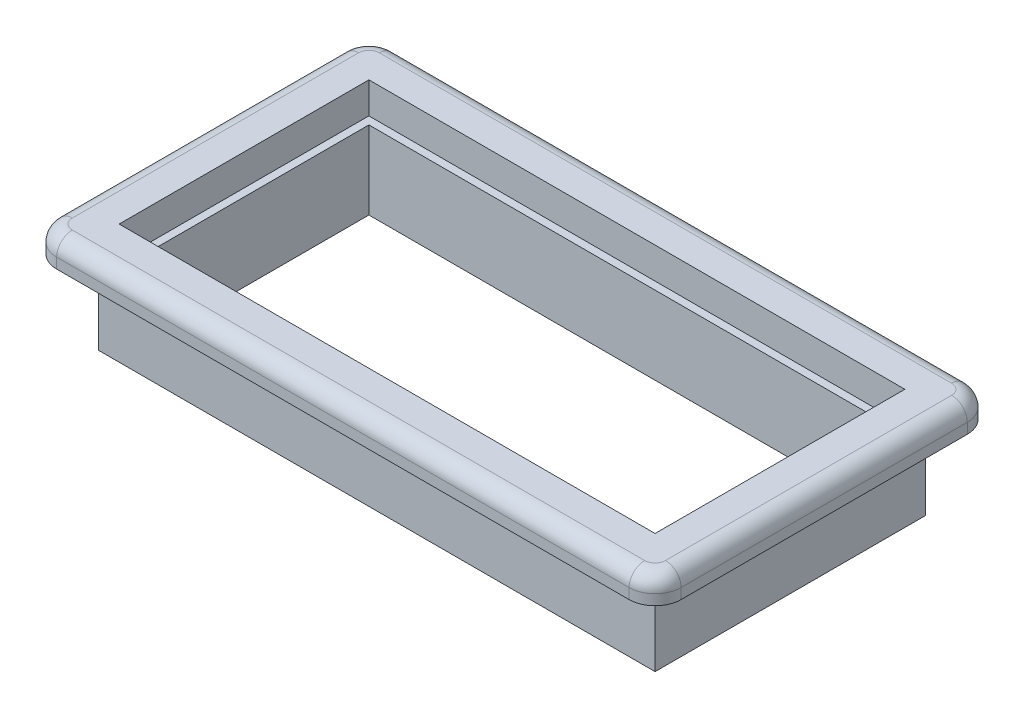
ISO-10303-21;
HEADER;
FILE_DESCRIPTION(('STEP AP214'),'2;1');
FILE_NAME('part.step','',(''),(''),'','','');
FILE_SCHEMA(('AUTOMOTIVE_DESIGN { 1 0 10303 214 1 1 1 1 }'));
ENDSEC;
DATA;
#1=APPLICATION_CONTEXT('core data for automotive mechanical design processes');
#2=APPLICATION_PROTOCOL_DEFINITION('international standard','automotive_design',2000,#1);
#3=PRODUCT_CONTEXT('',#1,'mechanical');
#4=PRODUCT('Part','Part','',(#3));
#5=PRODUCT_RELATED_PRODUCT_CATEGORY('part','',(#4));
#6=PRODUCT_DEFINITION_FORMATION('','',#4);
#7=PRODUCT_DEFINITION_CONTEXT('part definition',#1,'design');
#8=PRODUCT_DEFINITION('design','',#6,#7);
#9=PRODUCT_DEFINITION_SHAPE('','',#8);
#10=(LENGTH_UNIT() NAMED_UNIT(*) SI_UNIT(.MILLI.,.METRE.));
#11=(NAMED_UNIT(*) PLANE_ANGLE_UNIT() SI_UNIT($,.RADIAN.));
#12=(NAMED_UNIT(*) SI_UNIT($,.STERADIAN.) SOLID_ANGLE_UNIT());
#13=UNCERTAINTY_MEASURE_WITH_UNIT(LENGTH_MEASURE(1.E-05),#10,'distance_accuracy_value','');
#14=(GEOMETRIC_REPRESENTATION_CONTEXT(3) GLOBAL_UNCERTAINTY_ASSIGNED_CONTEXT((#13)) GLOBAL_UNIT_ASSIGNED_CONTEXT((#10,
#11,#12)) REPRESENTATION_CONTEXT('',''));
#15=CARTESIAN_POINT('',(0.,0.,0.));
#16=DIRECTION('',(0.,0.,1.));
#17=DIRECTION('',(1.,0.,0.));
#18=AXIS2_PLACEMENT_3D('',#15,#16,#17);
#19=CARTESIAN_POINT('',(-55.,5.,27.5));
#20=DIRECTION('',(0.,-1.,0.));
#21=DIRECTION('',(0.,0.,-1.));
#22=AXIS2_PLACEMENT_3D('',#19,#20,#21);
#23=PLANE('',#22);
#24=DIRECTION('',(1.,0.,0.));
#25=VECTOR('',#24,1.);
#26=CARTESIAN_POINT('',(51.5,5.,24.));
#27=LINE('',#26,#25);
#28=CARTESIAN_POINT('',(-51.5,5.,24.));
#29=VERTEX_POINT('',#28);
#30=CARTESIAN_POINT('',(51.5,5.,24.));
#31=VERTEX_POINT('',#30);
#32=EDGE_CURVE('E389',#29,#31,#27,.T.);
#33=ORIENTED_EDGE('',*,*,#32,.F.);
#34=DIRECTION('',(0.,0.,1.));
#35=VECTOR('',#34,1.);
#36=CARTESIAN_POINT('',(-51.5,5.,-24.));
#37=LINE('',#36,#35);
#38=CARTESIAN_POINT('',(-51.5,5.,-24.));
#39=VERTEX_POINT('',#38);
#40=EDGE_CURVE('E50',#39,#29,#37,.T.);
#41=ORIENTED_EDGE('',*,*,#40,.F.);
#42=DIRECTION('',(-1.,0.,0.));
#43=VECTOR('',#42,1.);
#44=CARTESIAN_POINT('',(51.5,5.,-24.));
#45=LINE('',#44,#43);
#46=CARTESIAN_POINT('',(51.5,5.,-24.));
#47=VERTEX_POINT('',#46);
#48=EDGE_CURVE('E379',#47,#39,#45,.T.);
#49=ORIENTED_EDGE('',*,*,#48,.F.);
#50=DIRECTION('',(0.,0.,-1.));
#51=VECTOR('',#50,1.);
#52=CARTESIAN_POINT('',(51.5,5.,-24.));
#53=LINE('',#52,#51);
#54=EDGE_CURVE('E392',#31,#47,#53,.T.);
#55=ORIENTED_EDGE('',*,*,#54,.F.);
#56=EDGE_LOOP('',(#33,#41,#49,#55));
#57=FACE_BOUND('',#56,.T.);
#58=DIRECTION('',(0.,0.,-1.));
#59=VECTOR('',#58,1.);
#60=CARTESIAN_POINT('',(57.,5.,27.5));
#61=LINE('',#60,#59);
#62=CARTESIAN_POINT('',(57.,5.,27.5));
#63=VERTEX_POINT('',#62);
#64=CARTESIAN_POINT('',(57.,5.,-27.5));
#65=VERTEX_POINT('',#64);
#66=EDGE_CURVE('E274',#63,#65,#61,.T.);
#67=ORIENTED_EDGE('',*,*,#66,.T.);
#68=CARTESIAN_POINT('',(55.,5.,-27.5));
#69=DIRECTION('',(0.,-1.,0.));
#70=DIRECTION('',(0.,0.,-1.));
#71=AXIS2_PLACEMENT_3D('',#68,#69,#70);
#72=CIRCLE('',#71,2.);
#73=CARTESIAN_POINT('',(55.,5.,-29.5));
#74=VERTEX_POINT('',#73);
#75=EDGE_CURVE('E276',#65,#74,#72,.F.);
#76=ORIENTED_EDGE('',*,*,#75,.T.);
#77=DIRECTION('',(-1.,0.,0.));
#78=VECTOR('',#77,1.);
#79=CARTESIAN_POINT('',(-55.,5.,-29.5));
#80=LINE('',#79,#78);
#81=CARTESIAN_POINT('',(-55.,5.,-29.5));
#82=VERTEX_POINT('',#81);
#83=EDGE_CURVE('E262',#74,#82,#80,.T.);
#84=ORIENTED_EDGE('',*,*,#83,.T.);
#85=CARTESIAN_POINT('',(-55.,5.,-27.5));
#86=DIRECTION('',(0.,-1.,0.));
#87=DIRECTION('',(0.,0.,-1.));
#88=AXIS2_PLACEMENT_3D('',#85,#86,#87);
#89=CIRCLE('',#88,2.);
#90=CARTESIAN_POINT('',(-57.,5.,-27.5));
#91=VERTEX_POINT('',#90);
#92=EDGE_CURVE('E264',#82,#91,#89,.F.);
#93=ORIENTED_EDGE('',*,*,#92,.T.);
#94=DIRECTION('',(0.,0.,1.));
#95=VECTOR('',#94,1.);
#96=CARTESIAN_POINT('',(-57.,5.,27.5));
#97=LINE('',#96,#95);
#98=CARTESIAN_POINT('',(-57.,5.,27.5));
#99=VERTEX_POINT('',#98);
#100=EDGE_CURVE('E266',#91,#99,#97,.T.);
#101=ORIENTED_EDGE('',*,*,#100,.T.);
#102=CARTESIAN_POINT('',(-55.,5.,27.5));
#103=DIRECTION('',(0.,-1.,0.));
#104=DIRECTION('',(0.,0.,-1.));
#105=AXIS2_PLACEMENT_3D('',#102,#103,#104);
#106=CIRCLE('',#105,2.);
#107=CARTESIAN_POINT('',(-55.,5.,29.5));
#108=VERTEX_POINT('',#107);
#109=EDGE_CURVE('E268',#99,#108,#106,.F.);
#110=ORIENTED_EDGE('',*,*,#109,.T.);
#111=DIRECTION('',(1.,0.,0.));
#112=VECTOR('',#111,1.);
#113=CARTESIAN_POINT('',(-55.,5.,29.5));
#114=LINE('',#113,#112);
#115=CARTESIAN_POINT('',(55.,5.,29.5));
#116=VERTEX_POINT('',#115);
#117=EDGE_CURVE('E270',#108,#116,#114,.T.);
#118=ORIENTED_EDGE('',*,*,#117,.T.);
#119=CARTESIAN_POINT('',(55.,5.,27.5));
#120=DIRECTION('',(0.,-1.,0.));
#121=DIRECTION('',(0.,0.,-1.));
#122=AXIS2_PLACEMENT_3D('',#119,#120,#121);
#123=CIRCLE('',#122,2.);
#124=EDGE_CURVE('E272',#116,#63,#123,.F.);
#125=ORIENTED_EDGE('',*,*,#124,.T.);
#126=EDGE_LOOP('',(#67,#76,#84,#93,#101,#110,#118,#125));
#127=FACE_BOUND('',#126,.T.);
#128=ADVANCED_FACE('F33',(#57,#127),#23,.F.);
#129=CARTESIAN_POINT('',(-55.,0.,27.5));
#130=DIRECTION('',(0.,-1.,0.));
#131=DIRECTION('',(0.,0.,-1.));
#132=AXIS2_PLACEMENT_3D('',#129,#130,#131);
#133=PLANE('',#132);
#134=DIRECTION('',(0.,0.,-1.));
#135=VECTOR('',#134,1.);
#136=CARTESIAN_POINT('',(-53.5,0.,-26.));
#137=LINE('',#136,#135);
#138=CARTESIAN_POINT('',(-53.5,0.,26.));
#139=VERTEX_POINT('',#138);
#140=CARTESIAN_POINT('',(-53.5,0.,-26.));
#141=VERTEX_POINT('',#140);
#142=EDGE_CURVE('E337',#139,#141,#137,.T.);
#143=ORIENTED_EDGE('',*,*,#142,.F.);
#144=DIRECTION('',(-1.,0.,0.));
#145=VECTOR('',#144,1.);
#146=CARTESIAN_POINT('',(-53.5,0.,26.));
#147=LINE('',#146,#145);
#148=CARTESIAN_POINT('',(53.5,0.,26.));
#149=VERTEX_POINT('',#148);
#150=EDGE_CURVE('E342',#149,#139,#147,.T.);
#151=ORIENTED_EDGE('',*,*,#150,.F.);
#152=DIRECTION('',(0.,0.,1.));
#153=VECTOR('',#152,1.);
#154=CARTESIAN_POINT('',(53.5,0.,26.));
#155=LINE('',#154,#153);
#156=CARTESIAN_POINT('',(53.5,0.,-26.));
#157=VERTEX_POINT('',#156);
#158=EDGE_CURVE('E354',#157,#149,#155,.T.);
#159=ORIENTED_EDGE('',*,*,#158,.F.);
#160=DIRECTION('',(1.,0.,0.));
#161=VECTOR('',#160,1.);
#162=CARTESIAN_POINT('',(53.5,0.,-26.));
#163=LINE('',#162,#161);
#164=EDGE_CURVE('E351',#141,#157,#163,.T.);
#165=ORIENTED_EDGE('',*,*,#164,.F.);
#166=EDGE_LOOP('',(#143,#151,#159,#165));
#167=FACE_BOUND('',#166,.T.);
#168=CARTESIAN_POINT('',(-55.,0.,27.5));
#169=DIRECTION('',(0.,1.,0.));
#170=DIRECTION('',(0.,0.,-1.));
#171=AXIS2_PLACEMENT_3D('',#168,#169,#170);
#172=CIRCLE('',#171,5.);
#173=CARTESIAN_POINT('',(-60.,0.,27.5));
#174=VERTEX_POINT('',#173);
#175=CARTESIAN_POINT('',(-55.,0.,32.5));
#176=VERTEX_POINT('',#175);
#177=EDGE_CURVE('E217',#174,#176,#172,.T.);
#178=ORIENTED_EDGE('',*,*,#177,.F.);
#179=DIRECTION('',(0.,0.,1.));
#180=VECTOR('',#179,1.);
#181=CARTESIAN_POINT('',(-60.,0.,27.5));
#182=LINE('',#181,#180);
#183=CARTESIAN_POINT('',(-60.,0.,-27.5));
#184=VERTEX_POINT('',#183);
#185=EDGE_CURVE('E243',#184,#174,#182,.T.);
#186=ORIENTED_EDGE('',*,*,#185,.F.);
#187=CARTESIAN_POINT('',(-55.,0.,-27.5));
#188=DIRECTION('',(0.,1.,0.));
#189=DIRECTION('',(0.,0.,-1.));
#190=AXIS2_PLACEMENT_3D('',#187,#188,#189);
#191=CIRCLE('',#190,5.);
#192=CARTESIAN_POINT('',(-55.,0.,-32.5));
#193=VERTEX_POINT('',#192);
#194=EDGE_CURVE('E240',#193,#184,#191,.T.);
#195=ORIENTED_EDGE('',*,*,#194,.F.);
#196=DIRECTION('',(-1.,0.,0.));
#197=VECTOR('',#196,1.);
#198=CARTESIAN_POINT('',(-55.,0.,-32.5));
#199=LINE('',#198,#197);
#200=CARTESIAN_POINT('',(55.,0.,-32.5));
#201=VERTEX_POINT('',#200);
#202=EDGE_CURVE('E237',#201,#193,#199,.T.);
#203=ORIENTED_EDGE('',*,*,#202,.F.);
#204=CARTESIAN_POINT('',(55.,0.,-27.5));
#205=DIRECTION('',(0.,1.,0.));
#206=DIRECTION('',(0.,0.,-1.));
#207=AXIS2_PLACEMENT_3D('',#204,#205,#206);
#208=CIRCLE('',#207,5.);
#209=CARTESIAN_POINT('',(60.,0.,-27.5));
#210=VERTEX_POINT('',#209);
#211=EDGE_CURVE('E234',#210,#201,#208,.T.);
#212=ORIENTED_EDGE('',*,*,#211,.F.);
#213=DIRECTION('',(0.,0.,-1.));
#214=VECTOR('',#213,1.);
#215=CARTESIAN_POINT('',(60.,0.,27.5));
#216=LINE('',#215,#214);
#217=CARTESIAN_POINT('',(60.,0.,27.5));
#218=VERTEX_POINT('',#217);
#219=EDGE_CURVE('E231',#218,#210,#216,.T.);
#220=ORIENTED_EDGE('',*,*,#219,.F.);
#221=CARTESIAN_POINT('',(55.,0.,27.5));
#222=DIRECTION('',(0.,1.,0.));
#223=DIRECTION('',(0.,0.,1.));
#224=AXIS2_PLACEMENT_3D('',#221,#222,#223);
#225=CIRCLE('',#224,5.);
#226=CARTESIAN_POINT('',(55.,0.,32.5));
#227=VERTEX_POINT('',#226);
#228=EDGE_CURVE('E228',#227,#218,#225,.T.);
#229=ORIENTED_EDGE('',*,*,#228,.F.);
#230=DIRECTION('',(1.,0.,0.));
#231=VECTOR('',#230,1.);
#232=CARTESIAN_POINT('',(-55.,0.,32.5));
#233=LINE('',#232,#231);
#234=EDGE_CURVE('E225',#176,#227,#233,.T.);
#235=ORIENTED_EDGE('',*,*,#234,.F.);
#236=EDGE_LOOP('',(#178,#186,#195,#203,#212,#220,#229,#235));
#237=FACE_BOUND('',#236,.T.);
#238=ADVANCED_FACE('F430',(#167,#237),#133,.T.);
#239=CARTESIAN_POINT('',(-55.,5.,27.5));
#240=DIRECTION('',(0.,-1.,0.));
#241=DIRECTION('',(0.,0.,-1.));
#242=AXIS2_PLACEMENT_3D('',#239,#240,#241);
#243=CYLINDRICAL_SURFACE('',#242,5.);
#244=DIRECTION('',(0.,-1.,0.));
#245=VECTOR('',#244,1.);
#246=CARTESIAN_POINT('',(-55.,5.,32.5));
#247=LINE('',#246,#245);
#248=CARTESIAN_POINT('',(-55.,2.,32.5));
#249=VERTEX_POINT('',#248);
#250=EDGE_CURVE('E260',#249,#176,#247,.T.);
#251=ORIENTED_EDGE('',*,*,#250,.F.);
#252=CARTESIAN_POINT('',(-55.,2.,27.5));
#253=DIRECTION('',(0.,-1.,0.));
#254=DIRECTION('',(0.,0.,-1.));
#255=AXIS2_PLACEMENT_3D('',#252,#253,#254);
#256=CIRCLE('',#255,5.);
#257=CARTESIAN_POINT('',(-60.,2.,27.5));
#258=VERTEX_POINT('',#257);
#259=EDGE_CURVE('E288',#249,#258,#256,.T.);
#260=ORIENTED_EDGE('',*,*,#259,.T.);
#261=DIRECTION('',(0.,-1.,0.));
#262=VECTOR('',#261,1.);
#263=CARTESIAN_POINT('',(-60.,5.,27.5));
#264=LINE('',#263,#262);
#265=EDGE_CURVE('E246',#258,#174,#264,.T.);
#266=ORIENTED_EDGE('',*,*,#265,.T.);
#267=ORIENTED_EDGE('',*,*,#177,.T.);
#268=EDGE_LOOP('',(#251,#260,#266,#267));
#269=FACE_BOUND('',#268,.T.);
#270=ADVANCED_FACE('F435',(#269),#243,.T.);
#271=CARTESIAN_POINT('',(-55.,5.,32.5));
#272=DIRECTION('',(0.,0.,-1.));
#273=DIRECTION('',(-1.,0.,0.));
#274=AXIS2_PLACEMENT_3D('',#271,#272,#273);
#275=PLANE('',#274);
#276=DIRECTION('',(0.,-1.,0.));
#277=VECTOR('',#276,1.);
#278=CARTESIAN_POINT('',(55.,5.,32.5));
#279=LINE('',#278,#277);
#280=CARTESIAN_POINT('',(55.,2.,32.5));
#281=VERTEX_POINT('',#280);
#282=EDGE_CURVE('E258',#281,#227,#279,.T.);
#283=ORIENTED_EDGE('',*,*,#282,.F.);
#284=DIRECTION('',(1.,0.,0.));
#285=VECTOR('',#284,1.);
#286=CARTESIAN_POINT('',(-55.,2.,32.5));
#287=LINE('',#286,#285);
#288=EDGE_CURVE('E286',#281,#249,#287,.F.);
#289=ORIENTED_EDGE('',*,*,#288,.T.);
#290=ORIENTED_EDGE('',*,*,#250,.T.);
#291=ORIENTED_EDGE('',*,*,#234,.T.);
#292=EDGE_LOOP('',(#283,#289,#290,#291));
#293=FACE_BOUND('',#292,.T.);
#294=ADVANCED_FACE('F464',(#293),#275,.F.);
#295=CARTESIAN_POINT('',(55.,5.,27.5));
#296=DIRECTION('',(0.,-1.,0.));
#297=DIRECTION('',(0.,0.,-1.));
#298=AXIS2_PLACEMENT_3D('',#295,#296,#297);
#299=CYLINDRICAL_SURFACE('',#298,5.);
#300=DIRECTION('',(0.,-1.,0.));
#301=VECTOR('',#300,1.);
#302=CARTESIAN_POINT('',(60.,5.,27.5));
#303=LINE('',#302,#301);
#304=CARTESIAN_POINT('',(60.,2.,27.5));
#305=VERTEX_POINT('',#304);
#306=EDGE_CURVE('E256',#305,#218,#303,.T.);
#307=ORIENTED_EDGE('',*,*,#306,.F.);
#308=CARTESIAN_POINT('',(55.,2.,27.5));
#309=DIRECTION('',(0.,-1.,0.));
#310=DIRECTION('',(0.,0.,-1.));
#311=AXIS2_PLACEMENT_3D('',#308,#309,#310);
#312=CIRCLE('',#311,5.);
#313=EDGE_CURVE('E284',#305,#281,#312,.T.);
#314=ORIENTED_EDGE('',*,*,#313,.T.);
#315=ORIENTED_EDGE('',*,*,#282,.T.);
#316=ORIENTED_EDGE('',*,*,#228,.T.);
#317=EDGE_LOOP('',(#307,#314,#315,#316));
#318=FACE_BOUND('',#317,.T.);
#319=ADVANCED_FACE('F460',(#318),#299,.T.);
#320=CARTESIAN_POINT('',(60.,5.,27.5));
#321=DIRECTION('',(-1.,0.,0.));
#322=DIRECTION('',(0.,0.,1.));
#323=AXIS2_PLACEMENT_3D('',#320,#321,#322);
#324=PLANE('',#323);
#325=DIRECTION('',(0.,-1.,0.));
#326=VECTOR('',#325,1.);
#327=CARTESIAN_POINT('',(60.,5.,-27.5));
#328=LINE('',#327,#326);
#329=CARTESIAN_POINT('',(60.,2.,-27.5));
#330=VERTEX_POINT('',#329);
#331=EDGE_CURVE('E254',#330,#210,#328,.T.);
#332=ORIENTED_EDGE('',*,*,#331,.F.);
#333=DIRECTION('',(0.,0.,-1.));
#334=VECTOR('',#333,1.);
#335=CARTESIAN_POINT('',(60.,2.,27.5));
#336=LINE('',#335,#334);
#337=EDGE_CURVE('E282',#330,#305,#336,.F.);
#338=ORIENTED_EDGE('',*,*,#337,.T.);
#339=ORIENTED_EDGE('',*,*,#306,.T.);
#340=ORIENTED_EDGE('',*,*,#219,.T.);
#341=EDGE_LOOP('',(#332,#338,#339,#340));
#342=FACE_BOUND('',#341,.T.);
#343=ADVANCED_FACE('F456',(#342),#324,.F.);
#344=CARTESIAN_POINT('',(55.,5.,-27.5));
#345=DIRECTION('',(0.,-1.,0.));
#346=DIRECTION('',(0.,0.,-1.));
#347=AXIS2_PLACEMENT_3D('',#344,#345,#346);
#348=CYLINDRICAL_SURFACE('',#347,5.);
#349=DIRECTION('',(0.,-1.,0.));
#350=VECTOR('',#349,1.);
#351=CARTESIAN_POINT('',(55.,5.,-32.5));
#352=LINE('',#351,#350);
#353=CARTESIAN_POINT('',(55.,2.,-32.5));
#354=VERTEX_POINT('',#353);
#355=EDGE_CURVE('E252',#354,#201,#352,.T.);
#356=ORIENTED_EDGE('',*,*,#355,.F.);
#357=CARTESIAN_POINT('',(55.,2.,-27.5));
#358=DIRECTION('',(0.,-1.,0.));
#359=DIRECTION('',(0.,0.,-1.));
#360=AXIS2_PLACEMENT_3D('',#357,#358,#359);
#361=CIRCLE('',#360,5.);
#362=EDGE_CURVE('E279',#354,#330,#361,.T.);
#363=ORIENTED_EDGE('',*,*,#362,.T.);
#364=ORIENTED_EDGE('',*,*,#331,.T.);
#365=ORIENTED_EDGE('',*,*,#211,.T.);
#366=EDGE_LOOP('',(#356,#363,#364,#365));
#367=FACE_BOUND('',#366,.T.);
#368=ADVANCED_FACE('F452',(#367),#348,.T.);
#369=CARTESIAN_POINT('',(-55.,5.,-32.5));
#370=DIRECTION('',(0.,0.,1.));
#371=DIRECTION('',(1.,0.,0.));
#372=AXIS2_PLACEMENT_3D('',#369,#370,#371);
#373=PLANE('',#372);
#374=DIRECTION('',(0.,-1.,0.));
#375=VECTOR('',#374,1.);
#376=CARTESIAN_POINT('',(-55.,5.,-32.5));
#377=LINE('',#376,#375);
#378=CARTESIAN_POINT('',(-55.,2.,-32.5));
#379=VERTEX_POINT('',#378);
#380=EDGE_CURVE('E250',#379,#193,#377,.T.);
#381=ORIENTED_EDGE('',*,*,#380,.F.);
#382=DIRECTION('',(-1.,0.,0.));
#383=VECTOR('',#382,1.);
#384=CARTESIAN_POINT('',(-55.,2.,-32.5));
#385=LINE('',#384,#383);
#386=EDGE_CURVE('E11',#379,#354,#385,.F.);
#387=ORIENTED_EDGE('',*,*,#386,.T.);
#388=ORIENTED_EDGE('',*,*,#355,.T.);
#389=ORIENTED_EDGE('',*,*,#202,.T.);
#390=EDGE_LOOP('',(#381,#387,#388,#389));
#391=FACE_BOUND('',#390,.T.);
#392=ADVANCED_FACE('F448',(#391),#373,.F.);
#393=CARTESIAN_POINT('',(-55.,5.,-27.5));
#394=DIRECTION('',(0.,-1.,0.));
#395=DIRECTION('',(0.,0.,-1.));
#396=AXIS2_PLACEMENT_3D('',#393,#394,#395);
#397=CYLINDRICAL_SURFACE('',#396,5.);
#398=DIRECTION('',(0.,-1.,0.));
#399=VECTOR('',#398,1.);
#400=CARTESIAN_POINT('',(-60.,5.,-27.5));
#401=LINE('',#400,#399);
#402=CARTESIAN_POINT('',(-60.,2.,-27.5));
#403=VERTEX_POINT('',#402);
#404=EDGE_CURVE('E248',#403,#184,#401,.T.);
#405=ORIENTED_EDGE('',*,*,#404,.F.);
#406=CARTESIAN_POINT('',(-55.,2.,-27.5));
#407=DIRECTION('',(0.,-1.,0.));
#408=DIRECTION('',(0.,0.,-1.));
#409=AXIS2_PLACEMENT_3D('',#406,#407,#408);
#410=CIRCLE('',#409,5.);
#411=EDGE_CURVE('E42',#403,#379,#410,.T.);
#412=ORIENTED_EDGE('',*,*,#411,.T.);
#413=ORIENTED_EDGE('',*,*,#380,.T.);
#414=ORIENTED_EDGE('',*,*,#194,.T.);
#415=EDGE_LOOP('',(#405,#412,#413,#414));
#416=FACE_BOUND('',#415,.T.);
#417=ADVANCED_FACE('F444',(#416),#397,.T.);
#418=CARTESIAN_POINT('',(-60.,5.,27.5));
#419=DIRECTION('',(1.,0.,0.));
#420=DIRECTION('',(0.,0.,-1.));
#421=AXIS2_PLACEMENT_3D('',#418,#419,#420);
#422=PLANE('',#421);
#423=ORIENTED_EDGE('',*,*,#265,.F.);
#424=DIRECTION('',(0.,0.,1.));
#425=VECTOR('',#424,1.);
#426=CARTESIAN_POINT('',(-60.,2.,27.5));
#427=LINE('',#426,#425);
#428=EDGE_CURVE('E290',#258,#403,#427,.F.);
#429=ORIENTED_EDGE('',*,*,#428,.T.);
#430=ORIENTED_EDGE('',*,*,#404,.T.);
#431=ORIENTED_EDGE('',*,*,#185,.T.);
#432=EDGE_LOOP('',(#423,#429,#430,#431));
#433=FACE_BOUND('',#432,.T.);
#434=ADVANCED_FACE('F441',(#433),#422,.F.);
#435=CARTESIAN_POINT('',(50.,5.,22.5));
#436=DIRECTION('',(-1.,0.,0.));
#437=DIRECTION('',(0.,0.,1.));
#438=AXIS2_PLACEMENT_3D('',#435,#436,#437);
#439=PLANE('',#438);
#440=DIRECTION('',(0.,0.,-1.));
#441=VECTOR('',#440,1.);
#442=CARTESIAN_POINT('',(50.,-1.,22.5));
#443=LINE('',#442,#441);
#444=CARTESIAN_POINT('',(50.,-1.,22.5));
#445=VERTEX_POINT('',#444);
#446=CARTESIAN_POINT('',(50.,-1.,-22.5));
#447=VERTEX_POINT('',#446);
#448=EDGE_CURVE('E58',#445,#447,#443,.T.);
#449=ORIENTED_EDGE('',*,*,#448,.T.);
#450=DIRECTION('',(0.,-1.,0.));
#451=VECTOR('',#450,1.);
#452=CARTESIAN_POINT('',(50.,5.,-22.5));
#453=LINE('',#452,#451);
#454=CARTESIAN_POINT('',(50.,-16.,-22.5));
#455=VERTEX_POINT('',#454);
#456=EDGE_CURVE('E209',#447,#455,#453,.T.);
#457=ORIENTED_EDGE('',*,*,#456,.T.);
#458=DIRECTION('',(0.,0.,1.));
#459=VECTOR('',#458,1.);
#460=CARTESIAN_POINT('',(50.,-16.,22.5));
#461=LINE('',#460,#459);
#462=CARTESIAN_POINT('',(50.,-16.,22.5));
#463=VERTEX_POINT('',#462);
#464=EDGE_CURVE('E316',#455,#463,#461,.T.);
#465=ORIENTED_EDGE('',*,*,#464,.T.);
#466=DIRECTION('',(0.,-1.,0.));
#467=VECTOR('',#466,1.);
#468=CARTESIAN_POINT('',(50.,5.,22.5));
#469=LINE('',#468,#467);
#470=EDGE_CURVE('E219',#445,#463,#469,.T.);
#471=ORIENTED_EDGE('',*,*,#470,.F.);
#472=EDGE_LOOP('',(#449,#457,#465,#471));
#473=FACE_BOUND('',#472,.T.);
#474=ADVANCED_FACE('F371',(#473),#439,.T.);
#475=CARTESIAN_POINT('',(-50.,5.,-22.5));
#476=DIRECTION('',(0.,0.,1.));
#477=DIRECTION('',(1.,0.,0.));
#478=AXIS2_PLACEMENT_3D('',#475,#476,#477);
#479=PLANE('',#478);
#480=DIRECTION('',(-1.,0.,0.));
#481=VECTOR('',#480,1.);
#482=CARTESIAN_POINT('',(50.,-1.,-22.5));
#483=LINE('',#482,#481);
#484=CARTESIAN_POINT('',(-50.,-1.,-22.5));
#485=VERTEX_POINT('',#484);
#486=EDGE_CURVE('E197',#447,#485,#483,.T.);
#487=ORIENTED_EDGE('',*,*,#486,.T.);
#488=DIRECTION('',(0.,-1.,0.));
#489=VECTOR('',#488,1.);
#490=CARTESIAN_POINT('',(-50.,5.,-22.5));
#491=LINE('',#490,#489);
#492=CARTESIAN_POINT('',(-50.,-16.,-22.5));
#493=VERTEX_POINT('',#492);
#494=EDGE_CURVE('E207',#485,#493,#491,.T.);
#495=ORIENTED_EDGE('',*,*,#494,.T.);
#496=DIRECTION('',(1.,0.,0.));
#497=VECTOR('',#496,1.);
#498=CARTESIAN_POINT('',(50.,-16.,-22.5));
#499=LINE('',#498,#497);
#500=EDGE_CURVE('E335',#493,#455,#499,.T.);
#501=ORIENTED_EDGE('',*,*,#500,.T.);
#502=ORIENTED_EDGE('',*,*,#456,.F.);
#503=EDGE_LOOP('',(#487,#495,#501,#502));
#504=FACE_BOUND('',#503,.T.);
#505=ADVANCED_FACE('F205',(#504),#479,.T.);
#506=CARTESIAN_POINT('',(-50.,5.,22.5));
#507=DIRECTION('',(1.,0.,0.));
#508=DIRECTION('',(0.,0.,-1.));
#509=AXIS2_PLACEMENT_3D('',#506,#507,#508);
#510=PLANE('',#509);
#511=DIRECTION('',(0.,0.,1.));
#512=VECTOR('',#511,1.);
#513=CARTESIAN_POINT('',(-50.,-1.,-22.5));
#514=LINE('',#513,#512);
#515=CARTESIAN_POINT('',(-50.,-1.,22.5));
#516=VERTEX_POINT('',#515);
#517=EDGE_CURVE('E193',#485,#516,#514,.T.);
#518=ORIENTED_EDGE('',*,*,#517,.T.);
#519=DIRECTION('',(0.,-1.,0.));
#520=VECTOR('',#519,1.);
#521=CARTESIAN_POINT('',(-50.,5.,22.5));
#522=LINE('',#521,#520);
#523=CARTESIAN_POINT('',(-50.,-16.,22.5));
#524=VERTEX_POINT('',#523);
#525=EDGE_CURVE('E215',#516,#524,#522,.T.);
#526=ORIENTED_EDGE('',*,*,#525,.T.);
#527=DIRECTION('',(0.,0.,-1.));
#528=VECTOR('',#527,1.);
#529=CARTESIAN_POINT('',(-50.,-16.,-22.5));
#530=LINE('',#529,#528);
#531=EDGE_CURVE('E213',#524,#493,#530,.T.);
#532=ORIENTED_EDGE('',*,*,#531,.T.);
#533=ORIENTED_EDGE('',*,*,#494,.F.);
#534=EDGE_LOOP('',(#518,#526,#532,#533));
#535=FACE_BOUND('',#534,.T.);
#536=ADVANCED_FACE('F211',(#535),#510,.T.);
#537=CARTESIAN_POINT('',(-50.,5.,22.5));
#538=DIRECTION('',(0.,0.,-1.));
#539=DIRECTION('',(-1.,0.,0.));
#540=AXIS2_PLACEMENT_3D('',#537,#538,#539);
#541=PLANE('',#540);
#542=DIRECTION('',(1.,0.,0.));
#543=VECTOR('',#542,1.);
#544=CARTESIAN_POINT('',(-50.,-1.,22.5));
#545=LINE('',#544,#543);
#546=EDGE_CURVE('E198',#516,#445,#545,.T.);
#547=ORIENTED_EDGE('',*,*,#546,.T.);
#548=ORIENTED_EDGE('',*,*,#470,.T.);
#549=DIRECTION('',(-1.,0.,0.));
#550=VECTOR('',#549,1.);
#551=CARTESIAN_POINT('',(-50.,-16.,22.5));
#552=LINE('',#551,#550);
#553=EDGE_CURVE('E322',#463,#524,#552,.T.);
#554=ORIENTED_EDGE('',*,*,#553,.T.);
#555=ORIENTED_EDGE('',*,*,#525,.F.);
#556=EDGE_LOOP('',(#547,#548,#554,#555));
#557=FACE_BOUND('',#556,.T.);
#558=ADVANCED_FACE('F370',(#557),#541,.T.);
#559=CARTESIAN_POINT('',(0.,-16.,0.));
#560=DIRECTION('',(0.,1.,0.));
#561=DIRECTION('',(0.,0.,1.));
#562=AXIS2_PLACEMENT_3D('',#559,#560,#561);
#563=PLANE('',#562);
#564=DIRECTION('',(0.,0.,-1.));
#565=VECTOR('',#564,1.);
#566=CARTESIAN_POINT('',(-53.5,-16.,-26.));
#567=LINE('',#566,#565);
#568=CARTESIAN_POINT('',(-53.5,-16.,26.));
#569=VERTEX_POINT('',#568);
#570=CARTESIAN_POINT('',(-53.5,-16.,-26.));
#571=VERTEX_POINT('',#570);
#572=EDGE_CURVE('E338',#569,#571,#567,.T.);
#573=ORIENTED_EDGE('',*,*,#572,.T.);
#574=DIRECTION('',(1.,0.,0.));
#575=VECTOR('',#574,1.);
#576=CARTESIAN_POINT('',(53.5,-16.,-26.));
#577=LINE('',#576,#575);
#578=CARTESIAN_POINT('',(53.5,-16.,-26.));
#579=VERTEX_POINT('',#578);
#580=EDGE_CURVE('E341',#571,#579,#577,.T.);
#581=ORIENTED_EDGE('',*,*,#580,.T.);
#582=DIRECTION('',(0.,0.,1.));
#583=VECTOR('',#582,1.);
#584=CARTESIAN_POINT('',(53.5,-16.,26.));
#585=LINE('',#584,#583);
#586=CARTESIAN_POINT('',(53.5,-16.,26.));
#587=VERTEX_POINT('',#586);
#588=EDGE_CURVE('E344',#579,#587,#585,.T.);
#589=ORIENTED_EDGE('',*,*,#588,.T.);
#590=DIRECTION('',(-1.,0.,0.));
#591=VECTOR('',#590,1.);
#592=CARTESIAN_POINT('',(-53.5,-16.,26.));
#593=LINE('',#592,#591);
#594=EDGE_CURVE('E346',#587,#569,#593,.T.);
#595=ORIENTED_EDGE('',*,*,#594,.T.);
#596=EDGE_LOOP('',(#573,#581,#589,#595));
#597=FACE_BOUND('',#596,.T.);
#598=ORIENTED_EDGE('',*,*,#464,.F.);
#599=ORIENTED_EDGE('',*,*,#500,.F.);
#600=ORIENTED_EDGE('',*,*,#531,.F.);
#601=ORIENTED_EDGE('',*,*,#553,.F.);
#602=EDGE_LOOP('',(#598,#599,#600,#601));
#603=FACE_BOUND('',#602,.T.);
#604=ADVANCED_FACE('F543',(#597,#603),#563,.F.);
#605=CARTESIAN_POINT('',(-53.5,-16.,-26.));
#606=DIRECTION('',(1.,0.,0.));
#607=DIRECTION('',(0.,0.,-1.));
#608=AXIS2_PLACEMENT_3D('',#605,#606,#607);
#609=PLANE('',#608);
#610=ORIENTED_EDGE('',*,*,#142,.T.);
#611=DIRECTION('',(0.,1.,0.));
#612=VECTOR('',#611,1.);
#613=CARTESIAN_POINT('',(-53.5,-16.,-26.));
#614=LINE('',#613,#612);
#615=EDGE_CURVE('E367',#571,#141,#614,.T.);
#616=ORIENTED_EDGE('',*,*,#615,.F.);
#617=ORIENTED_EDGE('',*,*,#572,.F.);
#618=DIRECTION('',(0.,1.,0.));
#619=VECTOR('',#618,1.);
#620=CARTESIAN_POINT('',(-53.5,-16.,26.));
#621=LINE('',#620,#619);
#622=EDGE_CURVE('E348',#569,#139,#621,.T.);
#623=ORIENTED_EDGE('',*,*,#622,.T.);
#624=EDGE_LOOP('',(#610,#616,#617,#623));
#625=FACE_BOUND('',#624,.T.);
#626=ADVANCED_FACE('F547',(#625),#609,.F.);
#627=CARTESIAN_POINT('',(53.5,-16.,-26.));
#628=DIRECTION('',(0.,0.,1.));
#629=DIRECTION('',(1.,0.,0.));
#630=AXIS2_PLACEMENT_3D('',#627,#628,#629);
#631=PLANE('',#630);
#632=ORIENTED_EDGE('',*,*,#164,.T.);
#633=DIRECTION('',(0.,1.,0.));
#634=VECTOR('',#633,1.);
#635=CARTESIAN_POINT('',(53.5,-16.,-26.));
#636=LINE('',#635,#634);
#637=EDGE_CURVE('E364',#579,#157,#636,.T.);
#638=ORIENTED_EDGE('',*,*,#637,.F.);
#639=ORIENTED_EDGE('',*,*,#580,.F.);
#640=ORIENTED_EDGE('',*,*,#615,.T.);
#641=EDGE_LOOP('',(#632,#638,#639,#640));
#642=FACE_BOUND('',#641,.T.);
#643=ADVANCED_FACE('F540',(#642),#631,.F.);
#644=CARTESIAN_POINT('',(53.5,-16.,26.));
#645=DIRECTION('',(-1.,0.,0.));
#646=DIRECTION('',(0.,0.,1.));
#647=AXIS2_PLACEMENT_3D('',#644,#645,#646);
#648=PLANE('',#647);
#649=ORIENTED_EDGE('',*,*,#158,.T.);
#650=DIRECTION('',(0.,1.,0.));
#651=VECTOR('',#650,1.);
#652=CARTESIAN_POINT('',(53.5,-16.,26.));
#653=LINE('',#652,#651);
#654=EDGE_CURVE('E361',#587,#149,#653,.T.);
#655=ORIENTED_EDGE('',*,*,#654,.F.);
#656=ORIENTED_EDGE('',*,*,#588,.F.);
#657=ORIENTED_EDGE('',*,*,#637,.T.);
#658=EDGE_LOOP('',(#649,#655,#656,#657));
#659=FACE_BOUND('',#658,.T.);
#660=ADVANCED_FACE('F499',(#659),#648,.F.);
#661=CARTESIAN_POINT('',(-53.5,-16.,26.));
#662=DIRECTION('',(0.,0.,-1.));
#663=DIRECTION('',(-1.,0.,0.));
#664=AXIS2_PLACEMENT_3D('',#661,#662,#663);
#665=PLANE('',#664);
#666=ORIENTED_EDGE('',*,*,#150,.T.);
#667=ORIENTED_EDGE('',*,*,#622,.F.);
#668=ORIENTED_EDGE('',*,*,#594,.F.);
#669=ORIENTED_EDGE('',*,*,#654,.T.);
#670=EDGE_LOOP('',(#666,#667,#668,#669));
#671=FACE_BOUND('',#670,.T.);
#672=ADVANCED_FACE('F494',(#671),#665,.F.);
#673=CARTESIAN_POINT('',(-55.,2.,27.5));
#674=DIRECTION('',(0.,-1.,0.));
#675=DIRECTION('',(0.,0.,-1.));
#676=AXIS2_PLACEMENT_3D('',#673,#674,#675);
#677=DEGENERATE_TOROIDAL_SURFACE('',#676,2.,3.,.T.);
#678=CARTESIAN_POINT('',(-57.,2.,27.5));
#679=DIRECTION('',(0.,0.,-1.));
#680=DIRECTION('',(-1.,0.,0.));
#681=AXIS2_PLACEMENT_3D('',#678,#679,#680);
#682=CIRCLE('',#681,3.);
#683=EDGE_CURVE('E309',#258,#99,#682,.T.);
#684=ORIENTED_EDGE('',*,*,#683,.F.);
#685=ORIENTED_EDGE('',*,*,#259,.F.);
#686=CARTESIAN_POINT('',(-55.,2.,29.5));
#687=DIRECTION('',(1.,0.,0.));
#688=DIRECTION('',(0.,0.,-1.));
#689=AXIS2_PLACEMENT_3D('',#686,#687,#688);
#690=CIRCLE('',#689,3.);
#691=EDGE_CURVE('E37',#108,#249,#690,.T.);
#692=ORIENTED_EDGE('',*,*,#691,.F.);
#693=ORIENTED_EDGE('',*,*,#109,.F.);
#694=EDGE_LOOP('',(#684,#685,#692,#693));
#695=FACE_BOUND('',#694,.T.);
#696=ADVANCED_FACE('F35',(#695),#677,.T.);
#697=CARTESIAN_POINT('',(-55.,2.,29.5));
#698=DIRECTION('',(1.,0.,0.));
#699=DIRECTION('',(0.,0.,-1.));
#700=AXIS2_PLACEMENT_3D('',#697,#698,#699);
#701=CYLINDRICAL_SURFACE('',#700,3.);
#702=ORIENTED_EDGE('',*,*,#691,.T.);
#703=ORIENTED_EDGE('',*,*,#288,.F.);
#704=CARTESIAN_POINT('',(55.,2.,29.5));
#705=DIRECTION('',(1.,0.,0.));
#706=DIRECTION('',(0.,0.,-1.));
#707=AXIS2_PLACEMENT_3D('',#704,#705,#706);
#708=CIRCLE('',#707,3.);
#709=EDGE_CURVE('E307',#116,#281,#708,.T.);
#710=ORIENTED_EDGE('',*,*,#709,.F.);
#711=ORIENTED_EDGE('',*,*,#117,.F.);
#712=EDGE_LOOP('',(#702,#703,#710,#711));
#713=FACE_BOUND('',#712,.T.);
#714=ADVANCED_FACE('F489',(#713),#701,.T.);
#715=CARTESIAN_POINT('',(-57.,2.,27.5));
#716=DIRECTION('',(0.,0.,1.));
#717=DIRECTION('',(1.,0.,0.));
#718=AXIS2_PLACEMENT_3D('',#715,#716,#717);
#719=CYLINDRICAL_SURFACE('',#718,3.);
#720=ORIENTED_EDGE('',*,*,#683,.T.);
#721=ORIENTED_EDGE('',*,*,#100,.F.);
#722=CARTESIAN_POINT('',(-57.,2.,-27.5));
#723=DIRECTION('',(0.,0.,-1.));
#724=DIRECTION('',(-1.,0.,0.));
#725=AXIS2_PLACEMENT_3D('',#722,#723,#724);
#726=CIRCLE('',#725,3.);
#727=EDGE_CURVE('E304',#403,#91,#726,.T.);
#728=ORIENTED_EDGE('',*,*,#727,.F.);
#729=ORIENTED_EDGE('',*,*,#428,.F.);
#730=EDGE_LOOP('',(#720,#721,#728,#729));
#731=FACE_BOUND('',#730,.T.);
#732=ADVANCED_FACE('F486',(#731),#719,.T.);
#733=CARTESIAN_POINT('',(55.,2.,27.5));
#734=DIRECTION('',(0.,-1.,0.));
#735=DIRECTION('',(0.,0.,-1.));
#736=AXIS2_PLACEMENT_3D('',#733,#734,#735);
#737=DEGENERATE_TOROIDAL_SURFACE('',#736,2.,3.,.T.);
#738=ORIENTED_EDGE('',*,*,#709,.T.);
#739=ORIENTED_EDGE('',*,*,#313,.F.);
#740=CARTESIAN_POINT('',(57.,2.,27.5));
#741=DIRECTION('',(0.,0.,-1.));
#742=DIRECTION('',(-1.,0.,0.));
#743=AXIS2_PLACEMENT_3D('',#740,#741,#742);
#744=CIRCLE('',#743,3.);
#745=EDGE_CURVE('E301',#63,#305,#744,.T.);
#746=ORIENTED_EDGE('',*,*,#745,.F.);
#747=ORIENTED_EDGE('',*,*,#124,.F.);
#748=EDGE_LOOP('',(#738,#739,#746,#747));
#749=FACE_BOUND('',#748,.T.);
#750=ADVANCED_FACE('F482',(#749),#737,.T.);
#751=CARTESIAN_POINT('',(-55.,2.,-27.5));
#752=DIRECTION('',(0.,-1.,0.));
#753=DIRECTION('',(0.,0.,-1.));
#754=AXIS2_PLACEMENT_3D('',#751,#752,#753);
#755=DEGENERATE_TOROIDAL_SURFACE('',#754,2.,3.,.T.);
#756=ORIENTED_EDGE('',*,*,#727,.T.);
#757=ORIENTED_EDGE('',*,*,#92,.F.);
#758=CARTESIAN_POINT('',(-55.,2.,-29.5));
#759=DIRECTION('',(1.,0.,0.));
#760=DIRECTION('',(0.,0.,-1.));
#761=AXIS2_PLACEMENT_3D('',#758,#759,#760);
#762=CIRCLE('',#761,3.);
#763=EDGE_CURVE('E298',#379,#82,#762,.T.);
#764=ORIENTED_EDGE('',*,*,#763,.F.);
#765=ORIENTED_EDGE('',*,*,#411,.F.);
#766=EDGE_LOOP('',(#756,#757,#764,#765));
#767=FACE_BOUND('',#766,.T.);
#768=ADVANCED_FACE('F478',(#767),#755,.T.);
#769=CARTESIAN_POINT('',(57.,2.,27.5));
#770=DIRECTION('',(0.,0.,-1.));
#771=DIRECTION('',(-1.,0.,0.));
#772=AXIS2_PLACEMENT_3D('',#769,#770,#771);
#773=CYLINDRICAL_SURFACE('',#772,3.);
#774=ORIENTED_EDGE('',*,*,#745,.T.);
#775=ORIENTED_EDGE('',*,*,#337,.F.);
#776=CARTESIAN_POINT('',(57.,2.,-27.5));
#777=DIRECTION('',(0.,0.,-1.));
#778=DIRECTION('',(-1.,0.,0.));
#779=AXIS2_PLACEMENT_3D('',#776,#777,#778);
#780=CIRCLE('',#779,3.);
#781=EDGE_CURVE('E295',#65,#330,#780,.T.);
#782=ORIENTED_EDGE('',*,*,#781,.F.);
#783=ORIENTED_EDGE('',*,*,#66,.F.);
#784=EDGE_LOOP('',(#774,#775,#782,#783));
#785=FACE_BOUND('',#784,.T.);
#786=ADVANCED_FACE('F474',(#785),#773,.T.);
#787=CARTESIAN_POINT('',(-55.,2.,-29.5));
#788=DIRECTION('',(-1.,0.,0.));
#789=DIRECTION('',(0.,0.,1.));
#790=AXIS2_PLACEMENT_3D('',#787,#788,#789);
#791=CYLINDRICAL_SURFACE('',#790,3.);
#792=ORIENTED_EDGE('',*,*,#763,.T.);
#793=ORIENTED_EDGE('',*,*,#83,.F.);
#794=CARTESIAN_POINT('',(55.,2.,-29.5));
#795=DIRECTION('',(1.,0.,0.));
#796=DIRECTION('',(0.,1.,0.));
#797=AXIS2_PLACEMENT_3D('',#794,#795,#796);
#798=CIRCLE('',#797,3.);
#799=EDGE_CURVE('E293',#354,#74,#798,.T.);
#800=ORIENTED_EDGE('',*,*,#799,.F.);
#801=ORIENTED_EDGE('',*,*,#386,.F.);
#802=EDGE_LOOP('',(#792,#793,#800,#801));
#803=FACE_BOUND('',#802,.T.);
#804=ADVANCED_FACE('F424',(#803),#791,.T.);
#805=CARTESIAN_POINT('',(55.,2.,-27.5));
#806=DIRECTION('',(0.,-1.,0.));
#807=DIRECTION('',(0.,0.,-1.));
#808=AXIS2_PLACEMENT_3D('',#805,#806,#807);
#809=DEGENERATE_TOROIDAL_SURFACE('',#808,2.,3.,.T.);
#810=ORIENTED_EDGE('',*,*,#781,.T.);
#811=ORIENTED_EDGE('',*,*,#362,.F.);
#812=ORIENTED_EDGE('',*,*,#799,.T.);
#813=ORIENTED_EDGE('',*,*,#75,.F.);
#814=EDGE_LOOP('',(#810,#811,#812,#813));
#815=FACE_BOUND('',#814,.T.);
#816=ADVANCED_FACE('F417',(#815),#809,.T.);
#817=CARTESIAN_POINT('',(-51.5,-1.,-24.));
#818=DIRECTION('',(-1.,0.,0.));
#819=DIRECTION('',(0.,0.,1.));
#820=AXIS2_PLACEMENT_3D('',#817,#818,#819);
#821=PLANE('',#820);
#822=ORIENTED_EDGE('',*,*,#40,.T.);
#823=DIRECTION('',(0.,1.,0.));
#824=VECTOR('',#823,1.);
#825=CARTESIAN_POINT('',(-51.5,-1.,24.));
#826=LINE('',#825,#824);
#827=CARTESIAN_POINT('',(-51.5,-1.,24.));
#828=VERTEX_POINT('',#827);
#829=EDGE_CURVE('E331',#828,#29,#826,.T.);
#830=ORIENTED_EDGE('',*,*,#829,.F.);
#831=DIRECTION('',(0.,0.,1.));
#832=VECTOR('',#831,1.);
#833=CARTESIAN_POINT('',(-51.5,-1.,-24.));
#834=LINE('',#833,#832);
#835=CARTESIAN_POINT('',(-51.5,-1.,-24.));
#836=VERTEX_POINT('',#835);
#837=EDGE_CURVE('E375',#836,#828,#834,.T.);
#838=ORIENTED_EDGE('',*,*,#837,.F.);
#839=DIRECTION('',(0.,1.,0.));
#840=VECTOR('',#839,1.);
#841=CARTESIAN_POINT('',(-51.5,-1.,-24.));
#842=LINE('',#841,#840);
#843=EDGE_CURVE('E296',#836,#39,#842,.T.);
#844=ORIENTED_EDGE('',*,*,#843,.T.);
#845=EDGE_LOOP('',(#822,#830,#838,#844));
#846=FACE_BOUND('',#845,.T.);
#847=ADVANCED_FACE('F415',(#846),#821,.F.);
#848=CARTESIAN_POINT('',(51.5,-1.,-24.));
#849=DIRECTION('',(0.,0.,-1.));
#850=DIRECTION('',(-1.,0.,0.));
#851=AXIS2_PLACEMENT_3D('',#848,#849,#850);
#852=PLANE('',#851);
#853=ORIENTED_EDGE('',*,*,#48,.T.);
#854=ORIENTED_EDGE('',*,*,#843,.F.);
#855=DIRECTION('',(-1.,0.,0.));
#856=VECTOR('',#855,1.);
#857=CARTESIAN_POINT('',(51.5,-1.,-24.));
#858=LINE('',#857,#856);
#859=CARTESIAN_POINT('',(51.5,-1.,-24.));
#860=VERTEX_POINT('',#859);
#861=EDGE_CURVE('E385',#860,#836,#858,.T.);
#862=ORIENTED_EDGE('',*,*,#861,.F.);
#863=DIRECTION('',(0.,1.,0.));
#864=VECTOR('',#863,1.);
#865=CARTESIAN_POINT('',(51.5,-1.,-24.));
#866=LINE('',#865,#864);
#867=EDGE_CURVE('E398',#860,#47,#866,.T.);
#868=ORIENTED_EDGE('',*,*,#867,.T.);
#869=EDGE_LOOP('',(#853,#854,#862,#868));
#870=FACE_BOUND('',#869,.T.);
#871=ADVANCED_FACE('F414',(#870),#852,.F.);
#872=CARTESIAN_POINT('',(51.5,-1.,-24.));
#873=DIRECTION('',(1.,0.,0.));
#874=DIRECTION('',(0.,0.,-1.));
#875=AXIS2_PLACEMENT_3D('',#872,#873,#874);
#876=PLANE('',#875);
#877=ORIENTED_EDGE('',*,*,#54,.T.);
#878=ORIENTED_EDGE('',*,*,#867,.F.);
#879=DIRECTION('',(0.,0.,-1.));
#880=VECTOR('',#879,1.);
#881=CARTESIAN_POINT('',(51.5,-1.,-24.));
#882=LINE('',#881,#880);
#883=CARTESIAN_POINT('',(51.5,-1.,24.));
#884=VERTEX_POINT('',#883);
#885=EDGE_CURVE('E382',#884,#860,#882,.T.);
#886=ORIENTED_EDGE('',*,*,#885,.F.);
#887=DIRECTION('',(0.,1.,0.));
#888=VECTOR('',#887,1.);
#889=CARTESIAN_POINT('',(51.5,-1.,24.));
#890=LINE('',#889,#888);
#891=EDGE_CURVE('E399',#884,#31,#890,.T.);
#892=ORIENTED_EDGE('',*,*,#891,.T.);
#893=EDGE_LOOP('',(#877,#878,#886,#892));
#894=FACE_BOUND('',#893,.T.);
#895=ADVANCED_FACE('F411',(#894),#876,.F.);
#896=CARTESIAN_POINT('',(51.5,-1.,24.));
#897=DIRECTION('',(0.,0.,1.));
#898=DIRECTION('',(1.,0.,0.));
#899=AXIS2_PLACEMENT_3D('',#896,#897,#898);
#900=PLANE('',#899);
#901=ORIENTED_EDGE('',*,*,#32,.T.);
#902=ORIENTED_EDGE('',*,*,#891,.F.);
#903=DIRECTION('',(1.,0.,0.));
#904=VECTOR('',#903,1.);
#905=CARTESIAN_POINT('',(51.5,-1.,24.));
#906=LINE('',#905,#904);
#907=EDGE_CURVE('E378',#828,#884,#906,.T.);
#908=ORIENTED_EDGE('',*,*,#907,.F.);
#909=ORIENTED_EDGE('',*,*,#829,.T.);
#910=EDGE_LOOP('',(#901,#902,#908,#909));
#911=FACE_BOUND('',#910,.T.);
#912=ADVANCED_FACE('F405',(#911),#900,.F.);
#913=CARTESIAN_POINT('',(0.,-1.,0.));
#914=DIRECTION('',(0.,-1.,0.));
#915=DIRECTION('',(0.,0.,-1.));
#916=AXIS2_PLACEMENT_3D('',#913,#914,#915);
#917=PLANE('',#916);
#918=ORIENTED_EDGE('',*,*,#546,.F.);
#919=ORIENTED_EDGE('',*,*,#517,.F.);
#920=ORIENTED_EDGE('',*,*,#486,.F.);
#921=ORIENTED_EDGE('',*,*,#448,.F.);
#922=EDGE_LOOP('',(#918,#919,#920,#921));
#923=FACE_BOUND('',#922,.T.);
#924=ORIENTED_EDGE('',*,*,#837,.T.);
#925=ORIENTED_EDGE('',*,*,#907,.T.);
#926=ORIENTED_EDGE('',*,*,#885,.T.);
#927=ORIENTED_EDGE('',*,*,#861,.T.);
#928=EDGE_LOOP('',(#924,#925,#926,#927));
#929=FACE_BOUND('',#928,.T.);
#930=ADVANCED_FACE('F195',(#923,#929),#917,.F.);
#931=CLOSED_SHELL('',(#128,#238,#270,#294,#319,#343,#368,#392,#417,#434,#474,#505,#536,#558,
#604,#626,#643,#660,#672,#696,#714,#732,#750,#768,#786,#804,#816,#847,#871,#895,#912,#930));
#932=MANIFOLD_SOLID_BREP('B2',#931);
#933=ADVANCED_BREP_SHAPE_REPRESENTATION('',(#18,#932),#14);
#934=SHAPE_DEFINITION_REPRESENTATION(#9,#933);
ENDSEC;
END-ISO-10303-21;
